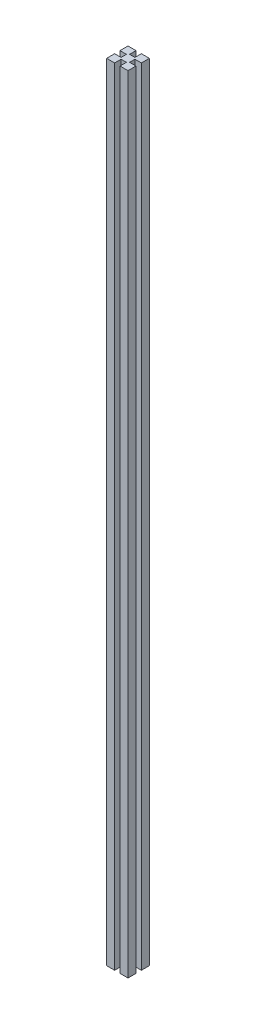
ISO-10303-21;
HEADER;
FILE_DESCRIPTION(('STEP AP214'),'2;1');
FILE_NAME('part.step','',(''),(''),'','','');
FILE_SCHEMA(('AUTOMOTIVE_DESIGN { 1 0 10303 214 1 1 1 1 }'));
ENDSEC;
DATA;
#1=APPLICATION_CONTEXT('core data for automotive mechanical design processes');
#2=APPLICATION_PROTOCOL_DEFINITION('international standard','automotive_design',2000,#1);
#3=PRODUCT_CONTEXT('',#1,'mechanical');
#4=PRODUCT('Part','Part','',(#3));
#5=PRODUCT_RELATED_PRODUCT_CATEGORY('part','',(#4));
#6=PRODUCT_DEFINITION_FORMATION('','',#4);
#7=PRODUCT_DEFINITION_CONTEXT('part definition',#1,'design');
#8=PRODUCT_DEFINITION('design','',#6,#7);
#9=PRODUCT_DEFINITION_SHAPE('','',#8);
#10=(LENGTH_UNIT() NAMED_UNIT(*) SI_UNIT(.MILLI.,.METRE.));
#11=(NAMED_UNIT(*) PLANE_ANGLE_UNIT() SI_UNIT($,.RADIAN.));
#12=(NAMED_UNIT(*) SI_UNIT($,.STERADIAN.) SOLID_ANGLE_UNIT());
#13=UNCERTAINTY_MEASURE_WITH_UNIT(LENGTH_MEASURE(1.E-05),#10,'distance_accuracy_value','');
#14=(GEOMETRIC_REPRESENTATION_CONTEXT(3) GLOBAL_UNCERTAINTY_ASSIGNED_CONTEXT((#13)) GLOBAL_UNIT_ASSIGNED_CONTEXT((#10,
#11,#12)) REPRESENTATION_CONTEXT('',''));
#15=CARTESIAN_POINT('',(0.,0.,0.));
#16=DIRECTION('',(0.,0.,1.));
#17=DIRECTION('',(1.,0.,0.));
#18=AXIS2_PLACEMENT_3D('',#15,#16,#17);
#19=CARTESIAN_POINT('',(10.,-368.3,10.));
#20=DIRECTION('',(1.,0.,0.));
#21=DIRECTION('',(0.,0.,-1.));
#22=AXIS2_PLACEMENT_3D('',#19,#20,#21);
#23=PLANE('',#22);
#24=DIRECTION('',(0.,-1.,0.));
#25=VECTOR('',#24,1.);
#26=CARTESIAN_POINT('',(10.,-368.3,2.5));
#27=LINE('',#26,#25);
#28=CARTESIAN_POINT('',(10.,368.3,2.5));
#29=VERTEX_POINT('',#28);
#30=CARTESIAN_POINT('',(10.,-368.3,2.5));
#31=VERTEX_POINT('',#30);
#32=EDGE_CURVE('E264',#29,#31,#27,.T.);
#33=ORIENTED_EDGE('',*,*,#32,.F.);
#34=DIRECTION('',(0.,0.,-1.));
#35=VECTOR('',#34,1.);
#36=CARTESIAN_POINT('',(10.,368.3,10.));
#37=LINE('',#36,#35);
#38=CARTESIAN_POINT('',(10.,368.3,10.));
#39=VERTEX_POINT('',#38);
#40=EDGE_CURVE('E270',#39,#29,#37,.T.);
#41=ORIENTED_EDGE('',*,*,#40,.F.);
#42=DIRECTION('',(0.,1.,0.));
#43=VECTOR('',#42,1.);
#44=CARTESIAN_POINT('',(10.,-368.3,10.));
#45=LINE('',#44,#43);
#46=CARTESIAN_POINT('',(10.,-368.3,10.));
#47=VERTEX_POINT('',#46);
#48=EDGE_CURVE('E301',#47,#39,#45,.T.);
#49=ORIENTED_EDGE('',*,*,#48,.F.);
#50=DIRECTION('',(0.,0.,-1.));
#51=VECTOR('',#50,1.);
#52=CARTESIAN_POINT('',(10.,-368.3,10.));
#53=LINE('',#52,#51);
#54=EDGE_CURVE('E285',#47,#31,#53,.T.);
#55=ORIENTED_EDGE('',*,*,#54,.T.);
#56=EDGE_LOOP('',(#33,#41,#49,#55));
#57=FACE_BOUND('',#56,.T.);
#58=ADVANCED_FACE('F33',(#57),#23,.T.);
#59=CARTESIAN_POINT('',(-10.,-368.3,10.));
#60=DIRECTION('',(0.,0.,1.));
#61=DIRECTION('',(1.,0.,0.));
#62=AXIS2_PLACEMENT_3D('',#59,#60,#61);
#63=PLANE('',#62);
#64=DIRECTION('',(0.,1.,0.));
#65=VECTOR('',#64,1.);
#66=CARTESIAN_POINT('',(2.5,-368.3,10.));
#67=LINE('',#66,#65);
#68=CARTESIAN_POINT('',(2.5,-368.3,10.));
#69=VERTEX_POINT('',#68);
#70=CARTESIAN_POINT('',(2.5,368.3,10.));
#71=VERTEX_POINT('',#70);
#72=EDGE_CURVE('E257',#69,#71,#67,.T.);
#73=ORIENTED_EDGE('',*,*,#72,.F.);
#74=DIRECTION('',(1.,0.,0.));
#75=VECTOR('',#74,1.);
#76=CARTESIAN_POINT('',(-10.,-368.3,10.));
#77=LINE('',#76,#75);
#78=EDGE_CURVE('E296',#69,#47,#77,.T.);
#79=ORIENTED_EDGE('',*,*,#78,.T.);
#80=ORIENTED_EDGE('',*,*,#48,.T.);
#81=DIRECTION('',(1.,0.,0.));
#82=VECTOR('',#81,1.);
#83=CARTESIAN_POINT('',(-10.,368.3,10.));
#84=LINE('',#83,#82);
#85=EDGE_CURVE('E280',#71,#39,#84,.T.);
#86=ORIENTED_EDGE('',*,*,#85,.F.);
#87=EDGE_LOOP('',(#73,#79,#80,#86));
#88=FACE_BOUND('',#87,.T.);
#89=ADVANCED_FACE('F375',(#88),#63,.T.);
#90=CARTESIAN_POINT('',(-10.,-368.3,10.));
#91=DIRECTION('',(-1.,0.,0.));
#92=DIRECTION('',(0.,0.,1.));
#93=AXIS2_PLACEMENT_3D('',#90,#91,#92);
#94=PLANE('',#93);
#95=DIRECTION('',(0.,-1.,0.));
#96=VECTOR('',#95,1.);
#97=CARTESIAN_POINT('',(-10.,-368.3,-2.5));
#98=LINE('',#97,#96);
#99=CARTESIAN_POINT('',(-10.,368.3,-2.5));
#100=VERTEX_POINT('',#99);
#101=CARTESIAN_POINT('',(-10.,-368.3,-2.5));
#102=VERTEX_POINT('',#101);
#103=EDGE_CURVE('E260',#100,#102,#98,.T.);
#104=ORIENTED_EDGE('',*,*,#103,.F.);
#105=DIRECTION('',(0.,0.,1.));
#106=VECTOR('',#105,1.);
#107=CARTESIAN_POINT('',(-10.,368.3,10.));
#108=LINE('',#107,#106);
#109=CARTESIAN_POINT('',(-10.,368.3,-10.));
#110=VERTEX_POINT('',#109);
#111=EDGE_CURVE('E277',#110,#100,#108,.T.);
#112=ORIENTED_EDGE('',*,*,#111,.F.);
#113=DIRECTION('',(0.,1.,0.));
#114=VECTOR('',#113,1.);
#115=CARTESIAN_POINT('',(-10.,-368.3,-10.));
#116=LINE('',#115,#114);
#117=CARTESIAN_POINT('',(-10.,-368.3,-10.));
#118=VERTEX_POINT('',#117);
#119=EDGE_CURVE('E308',#118,#110,#116,.T.);
#120=ORIENTED_EDGE('',*,*,#119,.F.);
#121=DIRECTION('',(0.,0.,1.));
#122=VECTOR('',#121,1.);
#123=CARTESIAN_POINT('',(-10.,-368.3,10.));
#124=LINE('',#123,#122);
#125=EDGE_CURVE('E293',#118,#102,#124,.T.);
#126=ORIENTED_EDGE('',*,*,#125,.T.);
#127=EDGE_LOOP('',(#104,#112,#120,#126));
#128=FACE_BOUND('',#127,.T.);
#129=ADVANCED_FACE('F345',(#128),#94,.T.);
#130=CARTESIAN_POINT('',(-10.,-368.3,-10.));
#131=DIRECTION('',(0.,0.,-1.));
#132=DIRECTION('',(-1.,0.,0.));
#133=AXIS2_PLACEMENT_3D('',#130,#131,#132);
#134=PLANE('',#133);
#135=DIRECTION('',(0.,-1.,0.));
#136=VECTOR('',#135,1.);
#137=CARTESIAN_POINT('',(2.5,-368.3,-10.));
#138=LINE('',#137,#136);
#139=CARTESIAN_POINT('',(2.5,368.3,-10.));
#140=VERTEX_POINT('',#139);
#141=CARTESIAN_POINT('',(2.5,-368.3,-10.));
#142=VERTEX_POINT('',#141);
#143=EDGE_CURVE('E267',#140,#142,#138,.T.);
#144=ORIENTED_EDGE('',*,*,#143,.F.);
#145=DIRECTION('',(-1.,0.,0.));
#146=VECTOR('',#145,1.);
#147=CARTESIAN_POINT('',(-10.,368.3,-10.));
#148=LINE('',#147,#146);
#149=CARTESIAN_POINT('',(10.,368.3,-10.));
#150=VERTEX_POINT('',#149);
#151=EDGE_CURVE('E274',#150,#140,#148,.T.);
#152=ORIENTED_EDGE('',*,*,#151,.F.);
#153=DIRECTION('',(0.,1.,0.));
#154=VECTOR('',#153,1.);
#155=CARTESIAN_POINT('',(10.,-368.3,-10.));
#156=LINE('',#155,#154);
#157=CARTESIAN_POINT('',(10.,-368.3,-10.));
#158=VERTEX_POINT('',#157);
#159=EDGE_CURVE('E300',#158,#150,#156,.T.);
#160=ORIENTED_EDGE('',*,*,#159,.F.);
#161=DIRECTION('',(-1.,0.,0.));
#162=VECTOR('',#161,1.);
#163=CARTESIAN_POINT('',(-10.,-368.3,-10.));
#164=LINE('',#163,#162);
#165=EDGE_CURVE('E289',#158,#142,#164,.T.);
#166=ORIENTED_EDGE('',*,*,#165,.T.);
#167=EDGE_LOOP('',(#144,#152,#160,#166));
#168=FACE_BOUND('',#167,.T.);
#169=ADVANCED_FACE('F329',(#168),#134,.T.);
#170=DIRECTION('',(0.,1.,0.));
#171=VECTOR('',#170,1.);
#172=CARTESIAN_POINT('',(10.,-368.3,-2.5));
#173=LINE('',#172,#171);
#174=CARTESIAN_POINT('',(10.,-368.3,-2.5));
#175=VERTEX_POINT('',#174);
#176=CARTESIAN_POINT('',(10.,368.3,-2.5));
#177=VERTEX_POINT('',#176);
#178=EDGE_CURVE('E262',#175,#177,#173,.T.);
#179=ORIENTED_EDGE('',*,*,#178,.F.);
#180=EDGE_CURVE('E284',#175,#158,#53,.T.);
#181=ORIENTED_EDGE('',*,*,#180,.T.);
#182=ORIENTED_EDGE('',*,*,#159,.T.);
#183=EDGE_CURVE('E269',#177,#150,#37,.T.);
#184=ORIENTED_EDGE('',*,*,#183,.F.);
#185=EDGE_LOOP('',(#179,#181,#182,#184));
#186=FACE_BOUND('',#185,.T.);
#187=ADVANCED_FACE('F35',(#186),#23,.T.);
#188=DIRECTION('',(0.,-1.,0.));
#189=VECTOR('',#188,1.);
#190=CARTESIAN_POINT('',(-2.5,-368.3,10.));
#191=LINE('',#190,#189);
#192=CARTESIAN_POINT('',(-2.5,368.3,10.));
#193=VERTEX_POINT('',#192);
#194=CARTESIAN_POINT('',(-2.5,-368.3,10.));
#195=VERTEX_POINT('',#194);
#196=EDGE_CURVE('E201',#193,#195,#191,.T.);
#197=ORIENTED_EDGE('',*,*,#196,.F.);
#198=CARTESIAN_POINT('',(-10.,368.3,10.));
#199=VERTEX_POINT('',#198);
#200=EDGE_CURVE('E281',#199,#193,#84,.T.);
#201=ORIENTED_EDGE('',*,*,#200,.F.);
#202=DIRECTION('',(0.,1.,0.));
#203=VECTOR('',#202,1.);
#204=CARTESIAN_POINT('',(-10.,-368.3,10.));
#205=LINE('',#204,#203);
#206=CARTESIAN_POINT('',(-10.,-368.3,10.));
#207=VERTEX_POINT('',#206);
#208=EDGE_CURVE('E305',#207,#199,#205,.T.);
#209=ORIENTED_EDGE('',*,*,#208,.F.);
#210=EDGE_CURVE('E297',#207,#195,#77,.T.);
#211=ORIENTED_EDGE('',*,*,#210,.T.);
#212=EDGE_LOOP('',(#197,#201,#209,#211));
#213=FACE_BOUND('',#212,.T.);
#214=ADVANCED_FACE('F361',(#213),#63,.T.);
#215=DIRECTION('',(0.,1.,0.));
#216=VECTOR('',#215,1.);
#217=CARTESIAN_POINT('',(-10.,-368.3,2.5));
#218=LINE('',#217,#216);
#219=CARTESIAN_POINT('',(-10.,-368.3,2.5));
#220=VERTEX_POINT('',#219);
#221=CARTESIAN_POINT('',(-10.,368.3,2.5));
#222=VERTEX_POINT('',#221);
#223=EDGE_CURVE('E56',#220,#222,#218,.T.);
#224=ORIENTED_EDGE('',*,*,#223,.F.);
#225=EDGE_CURVE('E292',#220,#207,#124,.T.);
#226=ORIENTED_EDGE('',*,*,#225,.T.);
#227=ORIENTED_EDGE('',*,*,#208,.T.);
#228=EDGE_CURVE('E276',#222,#199,#108,.T.);
#229=ORIENTED_EDGE('',*,*,#228,.F.);
#230=EDGE_LOOP('',(#224,#226,#227,#229));
#231=FACE_BOUND('',#230,.T.);
#232=ADVANCED_FACE('F355',(#231),#94,.T.);
#233=DIRECTION('',(0.,1.,0.));
#234=VECTOR('',#233,1.);
#235=CARTESIAN_POINT('',(-2.5,-368.3,-10.));
#236=LINE('',#235,#234);
#237=CARTESIAN_POINT('',(-2.5,-368.3,-10.));
#238=VERTEX_POINT('',#237);
#239=CARTESIAN_POINT('',(-2.5,368.3,-10.));
#240=VERTEX_POINT('',#239);
#241=EDGE_CURVE('E174',#238,#240,#236,.T.);
#242=ORIENTED_EDGE('',*,*,#241,.F.);
#243=EDGE_CURVE('E288',#238,#118,#164,.T.);
#244=ORIENTED_EDGE('',*,*,#243,.T.);
#245=ORIENTED_EDGE('',*,*,#119,.T.);
#246=EDGE_CURVE('E273',#240,#110,#148,.T.);
#247=ORIENTED_EDGE('',*,*,#246,.F.);
#248=EDGE_LOOP('',(#242,#244,#245,#247));
#249=FACE_BOUND('',#248,.T.);
#250=ADVANCED_FACE('F338',(#249),#134,.T.);
#251=CARTESIAN_POINT('',(0.,-368.3,0.));
#252=DIRECTION('',(0.,-1.,0.));
#253=DIRECTION('',(0.,0.,-1.));
#254=AXIS2_PLACEMENT_3D('',#251,#252,#253);
#255=PLANE('',#254);
#256=DIRECTION('',(0.,0.,-1.));
#257=VECTOR('',#256,1.);
#258=CARTESIAN_POINT('',(2.5,-368.3,-4.00000000000001));
#259=LINE('',#258,#257);
#260=CARTESIAN_POINT('',(2.5,-368.3,-4.00000000000001));
#261=VERTEX_POINT('',#260);
#262=EDGE_CURVE('E191',#261,#142,#259,.T.);
#263=ORIENTED_EDGE('',*,*,#262,.T.);
#264=ORIENTED_EDGE('',*,*,#165,.F.);
#265=ORIENTED_EDGE('',*,*,#180,.F.);
#266=DIRECTION('',(-1.,0.,0.));
#267=VECTOR('',#266,1.);
#268=CARTESIAN_POINT('',(4.,-368.3,-2.5));
#269=LINE('',#268,#267);
#270=CARTESIAN_POINT('',(4.,-368.3,-2.5));
#271=VERTEX_POINT('',#270);
#272=EDGE_CURVE('E209',#175,#271,#269,.T.);
#273=ORIENTED_EDGE('',*,*,#272,.T.);
#274=DIRECTION('',(0.,0.,1.));
#275=VECTOR('',#274,1.);
#276=CARTESIAN_POINT('',(4.,-368.3,-2.5));
#277=LINE('',#276,#275);
#278=CARTESIAN_POINT('',(4.,-368.3,2.5));
#279=VERTEX_POINT('',#278);
#280=EDGE_CURVE('E212',#271,#279,#277,.T.);
#281=ORIENTED_EDGE('',*,*,#280,.T.);
#282=DIRECTION('',(1.,0.,0.));
#283=VECTOR('',#282,1.);
#284=CARTESIAN_POINT('',(4.,-368.3,2.5));
#285=LINE('',#284,#283);
#286=EDGE_CURVE('E215',#279,#31,#285,.T.);
#287=ORIENTED_EDGE('',*,*,#286,.T.);
#288=ORIENTED_EDGE('',*,*,#54,.F.);
#289=ORIENTED_EDGE('',*,*,#78,.F.);
#290=DIRECTION('',(0.,0.,-1.));
#291=VECTOR('',#290,1.);
#292=CARTESIAN_POINT('',(2.5,-368.3,4.));
#293=LINE('',#292,#291);
#294=CARTESIAN_POINT('',(2.5,-368.3,4.));
#295=VERTEX_POINT('',#294);
#296=EDGE_CURVE('E250',#69,#295,#293,.T.);
#297=ORIENTED_EDGE('',*,*,#296,.T.);
#298=DIRECTION('',(-1.,0.,0.));
#299=VECTOR('',#298,1.);
#300=CARTESIAN_POINT('',(-2.5,-368.3,4.));
#301=LINE('',#300,#299);
#302=CARTESIAN_POINT('',(-2.5,-368.3,4.));
#303=VERTEX_POINT('',#302);
#304=EDGE_CURVE('E244',#295,#303,#301,.T.);
#305=ORIENTED_EDGE('',*,*,#304,.T.);
#306=DIRECTION('',(0.,0.,1.));
#307=VECTOR('',#306,1.);
#308=CARTESIAN_POINT('',(-2.5,-368.3,4.));
#309=LINE('',#308,#307);
#310=EDGE_CURVE('E247',#303,#195,#309,.T.);
#311=ORIENTED_EDGE('',*,*,#310,.T.);
#312=ORIENTED_EDGE('',*,*,#210,.F.);
#313=ORIENTED_EDGE('',*,*,#225,.F.);
#314=DIRECTION('',(1.,0.,0.));
#315=VECTOR('',#314,1.);
#316=CARTESIAN_POINT('',(-4.00000000000001,-368.3,2.5));
#317=LINE('',#316,#315);
#318=CARTESIAN_POINT('',(-4.00000000000001,-368.3,2.5));
#319=VERTEX_POINT('',#318);
#320=EDGE_CURVE('E231',#220,#319,#317,.T.);
#321=ORIENTED_EDGE('',*,*,#320,.T.);
#322=DIRECTION('',(0.,0.,-1.));
#323=VECTOR('',#322,1.);
#324=CARTESIAN_POINT('',(-4.00000000000001,-368.3,-2.5));
#325=LINE('',#324,#323);
#326=CARTESIAN_POINT('',(-4.00000000000001,-368.3,-2.5));
#327=VERTEX_POINT('',#326);
#328=EDGE_CURVE('E234',#319,#327,#325,.T.);
#329=ORIENTED_EDGE('',*,*,#328,.T.);
#330=DIRECTION('',(-1.,0.,0.));
#331=VECTOR('',#330,1.);
#332=CARTESIAN_POINT('',(-4.00000000000001,-368.3,-2.5));
#333=LINE('',#332,#331);
#334=EDGE_CURVE('E228',#327,#102,#333,.T.);
#335=ORIENTED_EDGE('',*,*,#334,.T.);
#336=ORIENTED_EDGE('',*,*,#125,.F.);
#337=ORIENTED_EDGE('',*,*,#243,.F.);
#338=DIRECTION('',(0.,0.,1.));
#339=VECTOR('',#338,1.);
#340=CARTESIAN_POINT('',(-2.5,-368.3,-4.00000000000001));
#341=LINE('',#340,#339);
#342=CARTESIAN_POINT('',(-2.5,-368.3,-4.00000000000001));
#343=VERTEX_POINT('',#342);
#344=EDGE_CURVE('E194',#238,#343,#341,.T.);
#345=ORIENTED_EDGE('',*,*,#344,.T.);
#346=DIRECTION('',(1.,0.,0.));
#347=VECTOR('',#346,1.);
#348=CARTESIAN_POINT('',(-2.5,-368.3,-4.00000000000001));
#349=LINE('',#348,#347);
#350=EDGE_CURVE('E184',#343,#261,#349,.T.);
#351=ORIENTED_EDGE('',*,*,#350,.T.);
#352=EDGE_LOOP('',(#263,#264,#265,#273,#281,#287,#288,#289,#297,#305,#311,#312,#313,#321,#329,
#335,#336,#337,#345,#351));
#353=FACE_BOUND('',#352,.T.);
#354=ADVANCED_FACE('F334',(#353),#255,.T.);
#355=CARTESIAN_POINT('',(0.,368.3,0.));
#356=DIRECTION('',(0.,-1.,0.));
#357=DIRECTION('',(0.,0.,-1.));
#358=AXIS2_PLACEMENT_3D('',#355,#356,#357);
#359=PLANE('',#358);
#360=ORIENTED_EDGE('',*,*,#151,.T.);
#361=DIRECTION('',(0.,0.,-1.));
#362=VECTOR('',#361,1.);
#363=CARTESIAN_POINT('',(2.5,368.3,-4.00000000000001));
#364=LINE('',#363,#362);
#365=CARTESIAN_POINT('',(2.5,368.3,-4.00000000000001));
#366=VERTEX_POINT('',#365);
#367=EDGE_CURVE('E190',#366,#140,#364,.T.);
#368=ORIENTED_EDGE('',*,*,#367,.F.);
#369=DIRECTION('',(1.,0.,0.));
#370=VECTOR('',#369,1.);
#371=CARTESIAN_POINT('',(-2.5,368.3,-4.00000000000001));
#372=LINE('',#371,#370);
#373=CARTESIAN_POINT('',(-2.5,368.3,-4.00000000000001));
#374=VERTEX_POINT('',#373);
#375=EDGE_CURVE('E181',#374,#366,#372,.T.);
#376=ORIENTED_EDGE('',*,*,#375,.F.);
#377=DIRECTION('',(0.,0.,-1.));
#378=VECTOR('',#377,1.);
#379=CARTESIAN_POINT('',(-2.5,368.3,0.));
#380=LINE('',#379,#378);
#381=EDGE_CURVE('E11',#374,#240,#380,.T.);
#382=ORIENTED_EDGE('',*,*,#381,.T.);
#383=ORIENTED_EDGE('',*,*,#246,.T.);
#384=ORIENTED_EDGE('',*,*,#111,.T.);
#385=DIRECTION('',(-1.,0.,0.));
#386=VECTOR('',#385,1.);
#387=CARTESIAN_POINT('',(-4.00000000000001,368.3,-2.5));
#388=LINE('',#387,#386);
#389=CARTESIAN_POINT('',(-4.00000000000001,368.3,-2.5));
#390=VERTEX_POINT('',#389);
#391=EDGE_CURVE('E222',#390,#100,#388,.T.);
#392=ORIENTED_EDGE('',*,*,#391,.F.);
#393=DIRECTION('',(0.,0.,-1.));
#394=VECTOR('',#393,1.);
#395=CARTESIAN_POINT('',(-4.00000000000001,368.3,-2.5));
#396=LINE('',#395,#394);
#397=CARTESIAN_POINT('',(-4.00000000000001,368.3,2.5));
#398=VERTEX_POINT('',#397);
#399=EDGE_CURVE('E224',#398,#390,#396,.T.);
#400=ORIENTED_EDGE('',*,*,#399,.F.);
#401=DIRECTION('',(-1.,0.,0.));
#402=VECTOR('',#401,1.);
#403=CARTESIAN_POINT('',(0.,368.3,2.5));
#404=LINE('',#403,#402);
#405=EDGE_CURVE('E315',#398,#222,#404,.T.);
#406=ORIENTED_EDGE('',*,*,#405,.T.);
#407=ORIENTED_EDGE('',*,*,#228,.T.);
#408=ORIENTED_EDGE('',*,*,#200,.T.);
#409=DIRECTION('',(0.,0.,1.));
#410=VECTOR('',#409,1.);
#411=CARTESIAN_POINT('',(-2.5,368.3,4.));
#412=LINE('',#411,#410);
#413=CARTESIAN_POINT('',(-2.5,368.3,4.));
#414=VERTEX_POINT('',#413);
#415=EDGE_CURVE('E242',#414,#193,#412,.T.);
#416=ORIENTED_EDGE('',*,*,#415,.F.);
#417=DIRECTION('',(-1.,0.,0.));
#418=VECTOR('',#417,1.);
#419=CARTESIAN_POINT('',(-2.5,368.3,4.));
#420=LINE('',#419,#418);
#421=CARTESIAN_POINT('',(2.5,368.3,4.));
#422=VERTEX_POINT('',#421);
#423=EDGE_CURVE('E48',#422,#414,#420,.T.);
#424=ORIENTED_EDGE('',*,*,#423,.F.);
#425=DIRECTION('',(0.,0.,1.));
#426=VECTOR('',#425,1.);
#427=CARTESIAN_POINT('',(2.5,368.3,0.));
#428=LINE('',#427,#426);
#429=EDGE_CURVE('E304',#422,#71,#428,.T.);
#430=ORIENTED_EDGE('',*,*,#429,.T.);
#431=ORIENTED_EDGE('',*,*,#85,.T.);
#432=ORIENTED_EDGE('',*,*,#40,.T.);
#433=DIRECTION('',(1.,0.,0.));
#434=VECTOR('',#433,1.);
#435=CARTESIAN_POINT('',(4.,368.3,2.5));
#436=LINE('',#435,#434);
#437=CARTESIAN_POINT('',(4.,368.3,2.5));
#438=VERTEX_POINT('',#437);
#439=EDGE_CURVE('E206',#438,#29,#436,.T.);
#440=ORIENTED_EDGE('',*,*,#439,.F.);
#441=DIRECTION('',(0.,0.,1.));
#442=VECTOR('',#441,1.);
#443=CARTESIAN_POINT('',(4.,368.3,-2.5));
#444=LINE('',#443,#442);
#445=CARTESIAN_POINT('',(4.,368.3,-2.5));
#446=VERTEX_POINT('',#445);
#447=EDGE_CURVE('E203',#446,#438,#444,.T.);
#448=ORIENTED_EDGE('',*,*,#447,.F.);
#449=DIRECTION('',(1.,0.,0.));
#450=VECTOR('',#449,1.);
#451=CARTESIAN_POINT('',(0.,368.3,-2.5));
#452=LINE('',#451,#450);
#453=EDGE_CURVE('E41',#446,#177,#452,.T.);
#454=ORIENTED_EDGE('',*,*,#453,.T.);
#455=ORIENTED_EDGE('',*,*,#183,.T.);
#456=EDGE_LOOP('',(#360,#368,#376,#382,#383,#384,#392,#400,#406,#407,#408,#416,#424,#430,#431,
#432,#440,#448,#454,#455));
#457=FACE_BOUND('',#456,.T.);
#458=ADVANCED_FACE('F189',(#457),#359,.F.);
#459=CARTESIAN_POINT('',(-2.5,-368.3,4.));
#460=DIRECTION('',(0.,0.,-1.));
#461=DIRECTION('',(-1.,0.,0.));
#462=AXIS2_PLACEMENT_3D('',#459,#460,#461);
#463=PLANE('',#462);
#464=DIRECTION('',(0.,1.,0.));
#465=VECTOR('',#464,1.);
#466=CARTESIAN_POINT('',(-2.5,-368.3,4.));
#467=LINE('',#466,#465);
#468=EDGE_CURVE('E253',#303,#414,#467,.T.);
#469=ORIENTED_EDGE('',*,*,#468,.F.);
#470=ORIENTED_EDGE('',*,*,#304,.F.);
#471=DIRECTION('',(0.,1.,0.));
#472=VECTOR('',#471,1.);
#473=CARTESIAN_POINT('',(2.5,-368.3,4.));
#474=LINE('',#473,#472);
#475=EDGE_CURVE('E225',#295,#422,#474,.T.);
#476=ORIENTED_EDGE('',*,*,#475,.T.);
#477=ORIENTED_EDGE('',*,*,#423,.T.);
#478=EDGE_LOOP('',(#469,#470,#476,#477));
#479=FACE_BOUND('',#478,.T.);
#480=ADVANCED_FACE('F367',(#479),#463,.F.);
#481=CARTESIAN_POINT('',(2.5,-368.3,4.));
#482=DIRECTION('',(1.,0.,0.));
#483=DIRECTION('',(0.,0.,-1.));
#484=AXIS2_PLACEMENT_3D('',#481,#482,#483);
#485=PLANE('',#484);
#486=ORIENTED_EDGE('',*,*,#72,.T.);
#487=ORIENTED_EDGE('',*,*,#429,.F.);
#488=ORIENTED_EDGE('',*,*,#475,.F.);
#489=ORIENTED_EDGE('',*,*,#296,.F.);
#490=EDGE_LOOP('',(#486,#487,#488,#489));
#491=FACE_BOUND('',#490,.T.);
#492=ADVANCED_FACE('F372',(#491),#485,.F.);
#493=CARTESIAN_POINT('',(-2.5,-368.3,4.));
#494=DIRECTION('',(-1.,0.,0.));
#495=DIRECTION('',(0.,0.,1.));
#496=AXIS2_PLACEMENT_3D('',#493,#494,#495);
#497=PLANE('',#496);
#498=ORIENTED_EDGE('',*,*,#196,.T.);
#499=ORIENTED_EDGE('',*,*,#310,.F.);
#500=ORIENTED_EDGE('',*,*,#468,.T.);
#501=ORIENTED_EDGE('',*,*,#415,.T.);
#502=EDGE_LOOP('',(#498,#499,#500,#501));
#503=FACE_BOUND('',#502,.T.);
#504=ADVANCED_FACE('F364',(#503),#497,.F.);
#505=CARTESIAN_POINT('',(-4.00000000000001,-368.3,-2.5));
#506=DIRECTION('',(0.,0.,-1.));
#507=DIRECTION('',(-1.,0.,0.));
#508=AXIS2_PLACEMENT_3D('',#505,#506,#507);
#509=PLANE('',#508);
#510=ORIENTED_EDGE('',*,*,#103,.T.);
#511=ORIENTED_EDGE('',*,*,#334,.F.);
#512=DIRECTION('',(0.,1.,0.));
#513=VECTOR('',#512,1.);
#514=CARTESIAN_POINT('',(-4.00000000000001,-368.3,-2.5));
#515=LINE('',#514,#513);
#516=EDGE_CURVE('E207',#327,#390,#515,.T.);
#517=ORIENTED_EDGE('',*,*,#516,.T.);
#518=ORIENTED_EDGE('',*,*,#391,.T.);
#519=EDGE_LOOP('',(#510,#511,#517,#518));
#520=FACE_BOUND('',#519,.T.);
#521=ADVANCED_FACE('F348',(#520),#509,.F.);
#522=CARTESIAN_POINT('',(-4.00000000000001,-368.3,-2.5));
#523=DIRECTION('',(1.,0.,0.));
#524=DIRECTION('',(0.,0.,-1.));
#525=AXIS2_PLACEMENT_3D('',#522,#523,#524);
#526=PLANE('',#525);
#527=ORIENTED_EDGE('',*,*,#516,.F.);
#528=ORIENTED_EDGE('',*,*,#328,.F.);
#529=DIRECTION('',(0.,1.,0.));
#530=VECTOR('',#529,1.);
#531=CARTESIAN_POINT('',(-4.00000000000001,-368.3,2.5));
#532=LINE('',#531,#530);
#533=EDGE_CURVE('E237',#319,#398,#532,.T.);
#534=ORIENTED_EDGE('',*,*,#533,.T.);
#535=ORIENTED_EDGE('',*,*,#399,.T.);
#536=EDGE_LOOP('',(#527,#528,#534,#535));
#537=FACE_BOUND('',#536,.T.);
#538=ADVANCED_FACE('F352',(#537),#526,.F.);
#539=CARTESIAN_POINT('',(-4.00000000000001,-368.3,2.5));
#540=DIRECTION('',(0.,0.,1.));
#541=DIRECTION('',(1.,0.,0.));
#542=AXIS2_PLACEMENT_3D('',#539,#540,#541);
#543=PLANE('',#542);
#544=ORIENTED_EDGE('',*,*,#223,.T.);
#545=ORIENTED_EDGE('',*,*,#405,.F.);
#546=ORIENTED_EDGE('',*,*,#533,.F.);
#547=ORIENTED_EDGE('',*,*,#320,.F.);
#548=EDGE_LOOP('',(#544,#545,#546,#547));
#549=FACE_BOUND('',#548,.T.);
#550=ADVANCED_FACE('F429',(#549),#543,.F.);
#551=CARTESIAN_POINT('',(4.,-368.3,2.5));
#552=DIRECTION('',(0.,0.,1.));
#553=DIRECTION('',(1.,0.,0.));
#554=AXIS2_PLACEMENT_3D('',#551,#552,#553);
#555=PLANE('',#554);
#556=ORIENTED_EDGE('',*,*,#32,.T.);
#557=ORIENTED_EDGE('',*,*,#286,.F.);
#558=DIRECTION('',(0.,1.,0.));
#559=VECTOR('',#558,1.);
#560=CARTESIAN_POINT('',(4.,-368.3,2.5));
#561=LINE('',#560,#559);
#562=EDGE_CURVE('E196',#279,#438,#561,.T.);
#563=ORIENTED_EDGE('',*,*,#562,.T.);
#564=ORIENTED_EDGE('',*,*,#439,.T.);
#565=EDGE_LOOP('',(#556,#557,#563,#564));
#566=FACE_BOUND('',#565,.T.);
#567=ADVANCED_FACE('F382',(#566),#555,.F.);
#568=CARTESIAN_POINT('',(4.,-368.3,-2.5));
#569=DIRECTION('',(-1.,0.,0.));
#570=DIRECTION('',(0.,0.,1.));
#571=AXIS2_PLACEMENT_3D('',#568,#569,#570);
#572=PLANE('',#571);
#573=ORIENTED_EDGE('',*,*,#562,.F.);
#574=ORIENTED_EDGE('',*,*,#280,.F.);
#575=DIRECTION('',(0.,1.,0.));
#576=VECTOR('',#575,1.);
#577=CARTESIAN_POINT('',(4.,-368.3,-2.5));
#578=LINE('',#577,#576);
#579=EDGE_CURVE('E218',#271,#446,#578,.T.);
#580=ORIENTED_EDGE('',*,*,#579,.T.);
#581=ORIENTED_EDGE('',*,*,#447,.T.);
#582=EDGE_LOOP('',(#573,#574,#580,#581));
#583=FACE_BOUND('',#582,.T.);
#584=ADVANCED_FACE('F385',(#583),#572,.F.);
#585=CARTESIAN_POINT('',(4.,-368.3,-2.5));
#586=DIRECTION('',(0.,0.,-1.));
#587=DIRECTION('',(-1.,0.,0.));
#588=AXIS2_PLACEMENT_3D('',#585,#586,#587);
#589=PLANE('',#588);
#590=ORIENTED_EDGE('',*,*,#178,.T.);
#591=ORIENTED_EDGE('',*,*,#453,.F.);
#592=ORIENTED_EDGE('',*,*,#579,.F.);
#593=ORIENTED_EDGE('',*,*,#272,.F.);
#594=EDGE_LOOP('',(#590,#591,#592,#593));
#595=FACE_BOUND('',#594,.T.);
#596=ADVANCED_FACE('F386',(#595),#589,.F.);
#597=CARTESIAN_POINT('',(2.5,-368.3,-4.00000000000001));
#598=DIRECTION('',(1.,0.,0.));
#599=DIRECTION('',(0.,0.,-1.));
#600=AXIS2_PLACEMENT_3D('',#597,#598,#599);
#601=PLANE('',#600);
#602=ORIENTED_EDGE('',*,*,#143,.T.);
#603=ORIENTED_EDGE('',*,*,#262,.F.);
#604=DIRECTION('',(0.,1.,0.));
#605=VECTOR('',#604,1.);
#606=CARTESIAN_POINT('',(2.5,-368.3,-4.00000000000001));
#607=LINE('',#606,#605);
#608=EDGE_CURVE('E186',#261,#366,#607,.T.);
#609=ORIENTED_EDGE('',*,*,#608,.T.);
#610=ORIENTED_EDGE('',*,*,#367,.T.);
#611=EDGE_LOOP('',(#602,#603,#609,#610));
#612=FACE_BOUND('',#611,.T.);
#613=ADVANCED_FACE('F332',(#612),#601,.F.);
#614=CARTESIAN_POINT('',(-2.5,-368.3,-4.00000000000001));
#615=DIRECTION('',(0.,0.,1.));
#616=DIRECTION('',(1.,0.,0.));
#617=AXIS2_PLACEMENT_3D('',#614,#615,#616);
#618=PLANE('',#617);
#619=ORIENTED_EDGE('',*,*,#608,.F.);
#620=ORIENTED_EDGE('',*,*,#350,.F.);
#621=DIRECTION('',(0.,1.,0.));
#622=VECTOR('',#621,1.);
#623=CARTESIAN_POINT('',(-2.5,-368.3,-4.00000000000001));
#624=LINE('',#623,#622);
#625=EDGE_CURVE('E171',#343,#374,#624,.T.);
#626=ORIENTED_EDGE('',*,*,#625,.T.);
#627=ORIENTED_EDGE('',*,*,#375,.T.);
#628=EDGE_LOOP('',(#619,#620,#626,#627));
#629=FACE_BOUND('',#628,.T.);
#630=ADVANCED_FACE('F180',(#629),#618,.F.);
#631=CARTESIAN_POINT('',(-2.5,-368.3,-4.00000000000001));
#632=DIRECTION('',(-1.,0.,0.));
#633=DIRECTION('',(0.,0.,1.));
#634=AXIS2_PLACEMENT_3D('',#631,#632,#633);
#635=PLANE('',#634);
#636=ORIENTED_EDGE('',*,*,#241,.T.);
#637=ORIENTED_EDGE('',*,*,#381,.F.);
#638=ORIENTED_EDGE('',*,*,#625,.F.);
#639=ORIENTED_EDGE('',*,*,#344,.F.);
#640=EDGE_LOOP('',(#636,#637,#638,#639));
#641=FACE_BOUND('',#640,.T.);
#642=ADVANCED_FACE('F170',(#641),#635,.F.);
#643=CLOSED_SHELL('',(#58,#89,#129,#169,#187,#214,#232,#250,#354,#458,#480,#492,#504,#521,#538,
#550,#567,#584,#596,#613,#630,#642));
#644=MANIFOLD_SOLID_BREP('B2',#643);
#645=ADVANCED_BREP_SHAPE_REPRESENTATION('',(#18,#644),#14);
#646=SHAPE_DEFINITION_REPRESENTATION(#9,#645);
ENDSEC;
END-ISO-10303-21;
